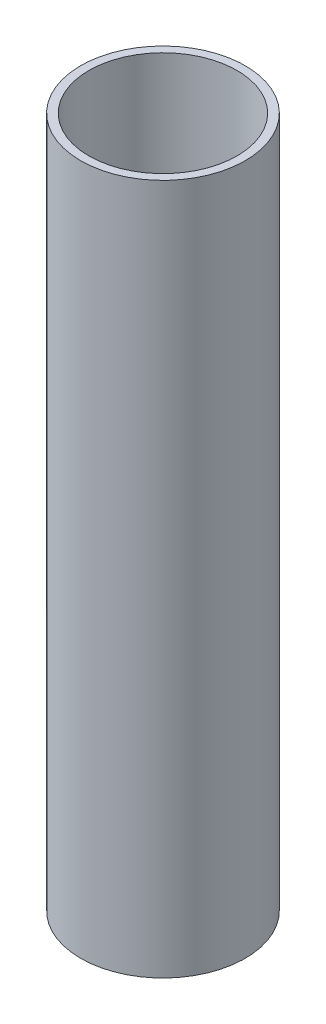
ISO-10303-21;
HEADER;
FILE_DESCRIPTION(('STEP AP214'),'2;1');
FILE_NAME('part.step','',(''),(''),'','','');
FILE_SCHEMA(('AUTOMOTIVE_DESIGN { 1 0 10303 214 1 1 1 1 }'));
ENDSEC;
DATA;
#1=APPLICATION_CONTEXT('core data for automotive mechanical design processes');
#2=APPLICATION_PROTOCOL_DEFINITION('international standard','automotive_design',2000,#1);
#3=PRODUCT_CONTEXT('',#1,'mechanical');
#4=PRODUCT('Part','Part','',(#3));
#5=PRODUCT_RELATED_PRODUCT_CATEGORY('part','',(#4));
#6=PRODUCT_DEFINITION_FORMATION('','',#4);
#7=PRODUCT_DEFINITION_CONTEXT('part definition',#1,'design');
#8=PRODUCT_DEFINITION('design','',#6,#7);
#9=PRODUCT_DEFINITION_SHAPE('','',#8);
#10=(LENGTH_UNIT() NAMED_UNIT(*) SI_UNIT(.MILLI.,.METRE.));
#11=(NAMED_UNIT(*) PLANE_ANGLE_UNIT() SI_UNIT($,.RADIAN.));
#12=(NAMED_UNIT(*) SI_UNIT($,.STERADIAN.) SOLID_ANGLE_UNIT());
#13=UNCERTAINTY_MEASURE_WITH_UNIT(LENGTH_MEASURE(1.E-05),#10,'distance_accuracy_value','');
#14=(GEOMETRIC_REPRESENTATION_CONTEXT(3) GLOBAL_UNCERTAINTY_ASSIGNED_CONTEXT((#13)) GLOBAL_UNIT_ASSIGNED_CONTEXT((#10,
#11,#12)) REPRESENTATION_CONTEXT('',''));
#15=CARTESIAN_POINT('',(0.,0.,0.));
#16=DIRECTION('',(0.,0.,1.));
#17=DIRECTION('',(1.,0.,0.));
#18=AXIS2_PLACEMENT_3D('',#15,#16,#17);
#19=CARTESIAN_POINT('',(0.,-106.6,0.));
#20=DIRECTION('',(0.,1.,0.));
#21=DIRECTION('',(0.,0.,1.));
#22=AXIS2_PLACEMENT_3D('',#19,#20,#21);
#23=CYLINDRICAL_SURFACE('',#22,12.7);
#24=CARTESIAN_POINT('',(0.,-106.6,0.));
#25=DIRECTION('',(0.,1.,0.));
#26=DIRECTION('',(0.,0.,1.));
#27=AXIS2_PLACEMENT_3D('',#24,#25,#26);
#28=CIRCLE('',#27,12.7);
#29=CARTESIAN_POINT('',(0.,-106.6,12.7));
#30=VERTEX_POINT('',#29);
#31=EDGE_CURVE('E10',#30,#30,#28,.T.);
#32=ORIENTED_EDGE('',*,*,#31,.T.);
#33=EDGE_LOOP('',(#32));
#34=FACE_BOUND('',#33,.T.);
#35=CARTESIAN_POINT('',(0.,0.,0.));
#36=DIRECTION('',(0.,1.,0.));
#37=DIRECTION('',(0.,0.,1.));
#38=AXIS2_PLACEMENT_3D('',#35,#36,#37);
#39=CIRCLE('',#38,12.7);
#40=CARTESIAN_POINT('',(0.,0.,12.7));
#41=VERTEX_POINT('',#40);
#42=EDGE_CURVE('E40',#41,#41,#39,.T.);
#43=ORIENTED_EDGE('',*,*,#42,.F.);
#44=EDGE_LOOP('',(#43));
#45=FACE_BOUND('',#44,.T.);
#46=ADVANCED_FACE('F37',(#34,#45),#23,.T.);
#47=CARTESIAN_POINT('',(0.,-106.6,0.));
#48=DIRECTION('',(0.,1.,0.));
#49=DIRECTION('',(0.,0.,1.));
#50=AXIS2_PLACEMENT_3D('',#47,#48,#49);
#51=PLANE('',#50);
#52=ORIENTED_EDGE('',*,*,#31,.F.);
#53=EDGE_LOOP('',(#52));
#54=FACE_BOUND('',#53,.T.);
#55=ADVANCED_FACE('F66',(#54),#51,.F.);
#56=CARTESIAN_POINT('',(0.,0.,0.));
#57=DIRECTION('',(0.,1.,0.));
#58=DIRECTION('',(0.,0.,1.));
#59=AXIS2_PLACEMENT_3D('',#56,#57,#58);
#60=PLANE('',#59);
#61=CARTESIAN_POINT('',(0.,0.,0.));
#62=DIRECTION('',(0.,1.,0.));
#63=DIRECTION('',(0.,0.,1.));
#64=AXIS2_PLACEMENT_3D('',#61,#62,#63);
#65=CIRCLE('',#64,11.43);
#66=CARTESIAN_POINT('',(0.,0.,11.43));
#67=VERTEX_POINT('',#66);
#68=EDGE_CURVE('E49',#67,#67,#65,.T.);
#69=ORIENTED_EDGE('',*,*,#68,.F.);
#70=EDGE_LOOP('',(#69));
#71=FACE_BOUND('',#70,.T.);
#72=ORIENTED_EDGE('',*,*,#42,.T.);
#73=EDGE_LOOP('',(#72));
#74=FACE_BOUND('',#73,.T.);
#75=ADVANCED_FACE('F60',(#71,#74),#60,.T.);
#76=CARTESIAN_POINT('',(0.,-101.6,0.));
#77=DIRECTION('',(0.,1.,0.));
#78=DIRECTION('',(0.,0.,1.));
#79=AXIS2_PLACEMENT_3D('',#76,#77,#78);
#80=CYLINDRICAL_SURFACE('',#79,11.43);
#81=CARTESIAN_POINT('',(0.,-101.6,0.));
#82=DIRECTION('',(0.,1.,0.));
#83=DIRECTION('',(0.,0.,1.));
#84=AXIS2_PLACEMENT_3D('',#81,#82,#83);
#85=CIRCLE('',#84,11.43);
#86=CARTESIAN_POINT('',(0.,-101.6,11.43));
#87=VERTEX_POINT('',#86);
#88=EDGE_CURVE('E47',#87,#87,#85,.T.);
#89=ORIENTED_EDGE('',*,*,#88,.F.);
#90=EDGE_LOOP('',(#89));
#91=FACE_BOUND('',#90,.T.);
#92=ORIENTED_EDGE('',*,*,#68,.T.);
#93=EDGE_LOOP('',(#92));
#94=FACE_BOUND('',#93,.T.);
#95=ADVANCED_FACE('F57',(#91,#94),#80,.F.);
#96=CARTESIAN_POINT('',(0.,-101.6,0.));
#97=DIRECTION('',(0.,1.,0.));
#98=DIRECTION('',(0.,0.,1.));
#99=AXIS2_PLACEMENT_3D('',#96,#97,#98);
#100=PLANE('',#99);
#101=ORIENTED_EDGE('',*,*,#88,.T.);
#102=EDGE_LOOP('',(#101));
#103=FACE_BOUND('',#102,.T.);
#104=ADVANCED_FACE('F55',(#103),#100,.T.);
#105=CLOSED_SHELL('',(#46,#55,#75,#95,#104));
#106=MANIFOLD_SOLID_BREP('B2',#105);
#107=ADVANCED_BREP_SHAPE_REPRESENTATION('',(#18,#106),#14);
#108=SHAPE_DEFINITION_REPRESENTATION(#9,#107);
ENDSEC;
END-ISO-10303-21;
